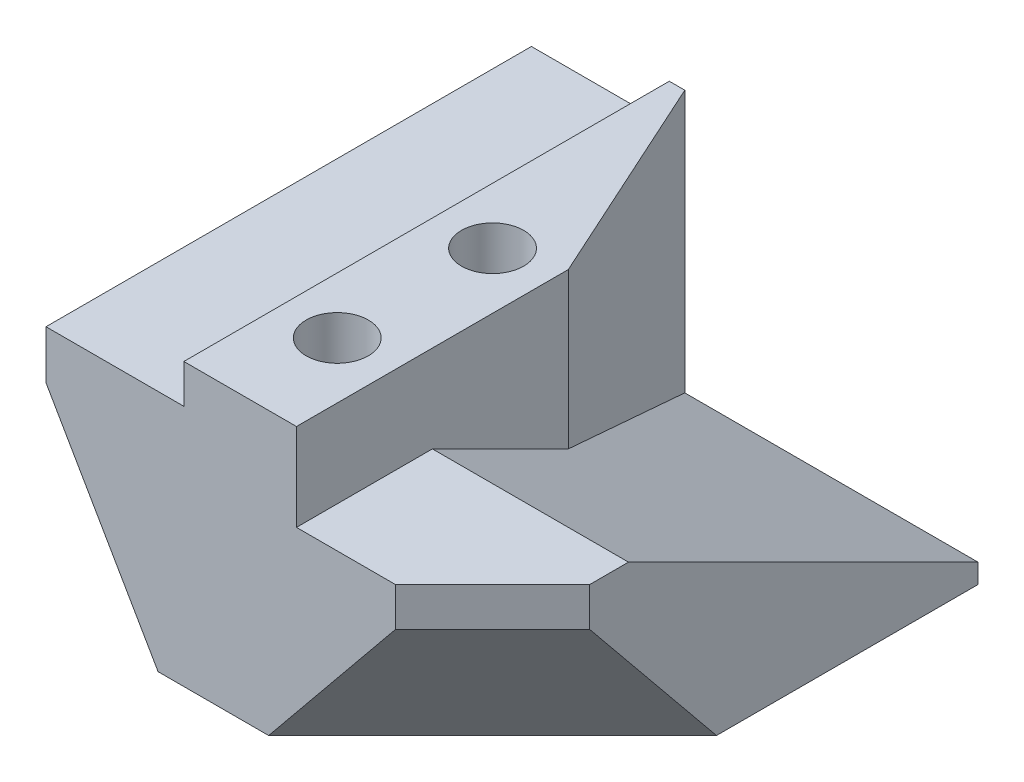
ISO-10303-21;
HEADER;
FILE_DESCRIPTION(('STEP AP214'),'2;1');
FILE_NAME('part.step','',(''),(''),'','','');
FILE_SCHEMA(('AUTOMOTIVE_DESIGN { 1 0 10303 214 1 1 1 1 }'));
ENDSEC;
DATA;
#1=APPLICATION_CONTEXT('core data for automotive mechanical design processes');
#2=APPLICATION_PROTOCOL_DEFINITION('international standard','automotive_design',2000,#1);
#3=PRODUCT_CONTEXT('',#1,'mechanical');
#4=PRODUCT('Part','Part','',(#3));
#5=PRODUCT_RELATED_PRODUCT_CATEGORY('part','',(#4));
#6=PRODUCT_DEFINITION_FORMATION('','',#4);
#7=PRODUCT_DEFINITION_CONTEXT('part definition',#1,'design');
#8=PRODUCT_DEFINITION('design','',#6,#7);
#9=PRODUCT_DEFINITION_SHAPE('','',#8);
#10=(LENGTH_UNIT() NAMED_UNIT(*) SI_UNIT(.MILLI.,.METRE.));
#11=(NAMED_UNIT(*) PLANE_ANGLE_UNIT() SI_UNIT($,.RADIAN.));
#12=(NAMED_UNIT(*) SI_UNIT($,.STERADIAN.) SOLID_ANGLE_UNIT());
#13=UNCERTAINTY_MEASURE_WITH_UNIT(LENGTH_MEASURE(1.E-05),#10,'distance_accuracy_value','');
#14=(GEOMETRIC_REPRESENTATION_CONTEXT(3) GLOBAL_UNCERTAINTY_ASSIGNED_CONTEXT((#13)) GLOBAL_UNIT_ASSIGNED_CONTEXT((#10,
#11,#12)) REPRESENTATION_CONTEXT('',''));
#15=CARTESIAN_POINT('',(0.,0.,0.));
#16=DIRECTION('',(0.,0.,1.));
#17=DIRECTION('',(1.,0.,0.));
#18=AXIS2_PLACEMENT_3D('',#15,#16,#17);
#19=CARTESIAN_POINT('',(12.9,8.5,-20.));
#20=DIRECTION('',(-1.,0.,0.));
#21=DIRECTION('',(0.,0.,1.));
#22=AXIS2_PLACEMENT_3D('',#19,#20,#21);
#23=PLANE('',#22);
#24=DIRECTION('',(0.,-0.447213595499958,-0.894427190999916));
#25=VECTOR('',#24,1.);
#26=CARTESIAN_POINT('',(12.9,6.,-7.));
#27=LINE('',#26,#25);
#28=CARTESIAN_POINT('',(12.9,6.,-7.));
#29=VERTEX_POINT('',#28);
#30=CARTESIAN_POINT('',(12.9,2.5,-14.));
#31=VERTEX_POINT('',#30);
#32=EDGE_CURVE('E336',#29,#31,#27,.T.);
#33=ORIENTED_EDGE('',*,*,#32,.T.);
#34=DIRECTION('',(0.,1.,0.));
#35=VECTOR('',#34,1.);
#36=CARTESIAN_POINT('',(12.9,-13.0461510298504,-14.));
#37=LINE('',#36,#35);
#38=CARTESIAN_POINT('',(12.9,10.5,-14.));
#39=VERTEX_POINT('',#38);
#40=EDGE_CURVE('E53',#31,#39,#37,.T.);
#41=ORIENTED_EDGE('',*,*,#40,.T.);
#42=DIRECTION('',(0.,0.,-1.));
#43=VECTOR('',#42,1.);
#44=CARTESIAN_POINT('',(12.9,10.5,-20.));
#45=LINE('',#44,#43);
#46=CARTESIAN_POINT('',(12.9,10.5,0.));
#47=VERTEX_POINT('',#46);
#48=EDGE_CURVE('E149',#47,#39,#45,.T.);
#49=ORIENTED_EDGE('',*,*,#48,.F.);
#50=DIRECTION('',(0.,-1.,0.));
#51=VECTOR('',#50,1.);
#52=CARTESIAN_POINT('',(12.9,8.5,0.));
#53=LINE('',#52,#51);
#54=CARTESIAN_POINT('',(12.9,6.,0.));
#55=VERTEX_POINT('',#54);
#56=EDGE_CURVE('E202',#47,#55,#53,.T.);
#57=ORIENTED_EDGE('',*,*,#56,.T.);
#58=DIRECTION('',(0.,0.,1.));
#59=VECTOR('',#58,1.);
#60=CARTESIAN_POINT('',(12.9,6.,-20.));
#61=LINE('',#60,#59);
#62=EDGE_CURVE('E159',#29,#55,#61,.T.);
#63=ORIENTED_EDGE('',*,*,#62,.F.);
#64=EDGE_LOOP('',(#33,#41,#49,#57,#63));
#65=FACE_BOUND('',#64,.T.);
#66=ADVANCED_FACE('F37',(#65),#23,.F.);
#67=CARTESIAN_POINT('',(10.,8.5,-13.));
#68=DIRECTION('',(0.,-1.,0.));
#69=DIRECTION('',(0.,0.,-1.));
#70=AXIS2_PLACEMENT_3D('',#67,#68,#69);
#71=CYLINDRICAL_SURFACE('',#70,1.6);
#72=CARTESIAN_POINT('',(10.,3.90000000000001,-13.));
#73=DIRECTION('',(0.,-1.,0.));
#74=DIRECTION('',(0.,0.,-1.));
#75=AXIS2_PLACEMENT_3D('',#72,#73,#74);
#76=CIRCLE('',#75,1.6);
#77=CARTESIAN_POINT('',(10.,3.90000000000001,-14.6));
#78=VERTEX_POINT('',#77);
#79=EDGE_CURVE('E234',#78,#78,#76,.T.);
#80=ORIENTED_EDGE('',*,*,#79,.T.);
#81=EDGE_LOOP('',(#80));
#82=FACE_BOUND('',#81,.T.);
#83=CARTESIAN_POINT('',(10.,10.5,-13.));
#84=DIRECTION('',(0.,1.,0.));
#85=DIRECTION('',(0.,0.,1.));
#86=AXIS2_PLACEMENT_3D('',#83,#84,#85);
#87=CIRCLE('',#86,1.6);
#88=CARTESIAN_POINT('',(10.,10.5,-11.4));
#89=VERTEX_POINT('',#88);
#90=EDGE_CURVE('E183',#89,#89,#87,.T.);
#91=ORIENTED_EDGE('',*,*,#90,.T.);
#92=EDGE_LOOP('',(#91));
#93=FACE_BOUND('',#92,.T.);
#94=ADVANCED_FACE('F259',(#82,#93),#71,.F.);
#95=CARTESIAN_POINT('',(10.,8.5,-5.));
#96=DIRECTION('',(0.,-1.,0.));
#97=DIRECTION('',(0.,0.,-1.));
#98=AXIS2_PLACEMENT_3D('',#95,#96,#97);
#99=CYLINDRICAL_SURFACE('',#98,1.6);
#100=CARTESIAN_POINT('',(10.,3.90000000000001,-5.));
#101=DIRECTION('',(0.,-1.,0.));
#102=DIRECTION('',(0.,0.,-1.));
#103=AXIS2_PLACEMENT_3D('',#100,#101,#102);
#104=CIRCLE('',#103,1.6);
#105=CARTESIAN_POINT('',(10.,3.90000000000001,-6.6));
#106=VERTEX_POINT('',#105);
#107=EDGE_CURVE('E237',#106,#106,#104,.T.);
#108=ORIENTED_EDGE('',*,*,#107,.T.);
#109=EDGE_LOOP('',(#108));
#110=FACE_BOUND('',#109,.T.);
#111=CARTESIAN_POINT('',(10.,10.5,-5.));
#112=DIRECTION('',(0.,1.,0.));
#113=DIRECTION('',(0.,0.,1.));
#114=AXIS2_PLACEMENT_3D('',#111,#112,#113);
#115=CIRCLE('',#114,1.6);
#116=CARTESIAN_POINT('',(10.,10.5,-3.4));
#117=VERTEX_POINT('',#116);
#118=EDGE_CURVE('E180',#117,#117,#115,.T.);
#119=ORIENTED_EDGE('',*,*,#118,.T.);
#120=EDGE_LOOP('',(#119));
#121=FACE_BOUND('',#120,.T.);
#122=ADVANCED_FACE('F266',(#110,#121),#99,.F.);
#123=CARTESIAN_POINT('',(0.,4.,0.));
#124=DIRECTION('',(1.,0.,0.));
#125=DIRECTION('',(0.,0.,-1.));
#126=AXIS2_PLACEMENT_3D('',#123,#124,#125);
#127=PLANE('',#126);
#128=DIRECTION('',(0.,1.,0.));
#129=VECTOR('',#128,1.);
#130=CARTESIAN_POINT('',(0.,-4.,-25.));
#131=LINE('',#130,#129);
#132=CARTESIAN_POINT('',(0.,6.00000000000006,-25.));
#133=VERTEX_POINT('',#132);
#134=CARTESIAN_POINT('',(0.,8.5,-25.));
#135=VERTEX_POINT('',#134);
#136=EDGE_CURVE('E321',#133,#135,#131,.T.);
#137=ORIENTED_EDGE('',*,*,#136,.F.);
#138=DIRECTION('',(0.,0.,1.));
#139=VECTOR('',#138,1.);
#140=CARTESIAN_POINT('',(0.,6.00000000000006,0.));
#141=LINE('',#140,#139);
#142=CARTESIAN_POINT('',(0.,6.00000000000006,0.));
#143=VERTEX_POINT('',#142);
#144=EDGE_CURVE('E213',#133,#143,#141,.T.);
#145=ORIENTED_EDGE('',*,*,#144,.T.);
#146=DIRECTION('',(0.,-1.,0.));
#147=VECTOR('',#146,1.);
#148=CARTESIAN_POINT('',(0.,4.,0.));
#149=LINE('',#148,#147);
#150=CARTESIAN_POINT('',(0.,8.5,0.));
#151=VERTEX_POINT('',#150);
#152=EDGE_CURVE('E205',#151,#143,#149,.T.);
#153=ORIENTED_EDGE('',*,*,#152,.F.);
#154=DIRECTION('',(0.,0.,1.));
#155=VECTOR('',#154,1.);
#156=CARTESIAN_POINT('',(0.,8.5,-20.));
#157=LINE('',#156,#155);
#158=EDGE_CURVE('E197',#135,#151,#157,.T.);
#159=ORIENTED_EDGE('',*,*,#158,.F.);
#160=EDGE_LOOP('',(#137,#145,#153,#159));
#161=FACE_BOUND('',#160,.T.);
#162=ADVANCED_FACE('F276',(#161),#127,.F.);
#163=CARTESIAN_POINT('',(0.,4.,0.));
#164=DIRECTION('',(0.,0.,-1.));
#165=DIRECTION('',(-1.,0.,0.));
#166=AXIS2_PLACEMENT_3D('',#163,#164,#165);
#167=PLANE('',#166);
#168=DIRECTION('',(-1.,0.,0.));
#169=VECTOR('',#168,1.);
#170=CARTESIAN_POINT('',(23.,-4.,0.));
#171=LINE('',#170,#169);
#172=CARTESIAN_POINT('',(11.4680273525782,-4.,0.));
#173=VERTEX_POINT('',#172);
#174=CARTESIAN_POINT('',(5.77350269189626,-4.,0.));
#175=VERTEX_POINT('',#174);
#176=EDGE_CURVE('E178',#173,#175,#171,.T.);
#177=ORIENTED_EDGE('',*,*,#176,.F.);
#178=DIRECTION('',(-0.632455532033674,-0.774596669241485,0.));
#179=VECTOR('',#178,1.);
#180=CARTESIAN_POINT('',(9.17442188206252,-6.80908153700972,0.));
#181=LINE('',#180,#179);
#182=CARTESIAN_POINT('',(18.,4.00000000000006,0.));
#183=VERTEX_POINT('',#182);
#184=EDGE_CURVE('E228',#173,#183,#181,.F.);
#185=ORIENTED_EDGE('',*,*,#184,.T.);
#186=DIRECTION('',(0.,1.,0.));
#187=VECTOR('',#186,1.);
#188=CARTESIAN_POINT('',(18.,6.,0.));
#189=LINE('',#188,#187);
#190=CARTESIAN_POINT('',(18.,6.,0.));
#191=VERTEX_POINT('',#190);
#192=EDGE_CURVE('E221',#183,#191,#189,.T.);
#193=ORIENTED_EDGE('',*,*,#192,.T.);
#194=DIRECTION('',(1.,0.,0.));
#195=VECTOR('',#194,1.);
#196=CARTESIAN_POINT('',(23.,6.,0.));
#197=LINE('',#196,#195);
#198=EDGE_CURVE('E166',#55,#191,#197,.T.);
#199=ORIENTED_EDGE('',*,*,#198,.F.);
#200=ORIENTED_EDGE('',*,*,#56,.F.);
#201=DIRECTION('',(1.,0.,0.));
#202=VECTOR('',#201,1.);
#203=CARTESIAN_POINT('',(7.1,10.5,0.));
#204=LINE('',#203,#202);
#205=CARTESIAN_POINT('',(7.1,10.5,0.));
#206=VERTEX_POINT('',#205);
#207=EDGE_CURVE('E189',#206,#47,#204,.T.);
#208=ORIENTED_EDGE('',*,*,#207,.F.);
#209=DIRECTION('',(0.,-1.,0.));
#210=VECTOR('',#209,1.);
#211=CARTESIAN_POINT('',(7.1,10.5,0.));
#212=LINE('',#211,#210);
#213=CARTESIAN_POINT('',(7.1,8.5,0.));
#214=VERTEX_POINT('',#213);
#215=EDGE_CURVE('E192',#206,#214,#212,.T.);
#216=ORIENTED_EDGE('',*,*,#215,.T.);
#217=DIRECTION('',(1.,0.,0.));
#218=VECTOR('',#217,1.);
#219=CARTESIAN_POINT('',(0.,8.5,0.));
#220=LINE('',#219,#218);
#221=EDGE_CURVE('E200',#151,#214,#220,.T.);
#222=ORIENTED_EDGE('',*,*,#221,.F.);
#223=ORIENTED_EDGE('',*,*,#152,.T.);
#224=DIRECTION('',(0.499999999999998,-0.86602540378444,0.));
#225=VECTOR('',#224,1.);
#226=CARTESIAN_POINT('',(5.77350269189626,-4.,0.));
#227=LINE('',#226,#225);
#228=EDGE_CURVE('E215',#143,#175,#227,.T.);
#229=ORIENTED_EDGE('',*,*,#228,.T.);
#230=EDGE_LOOP('',(#177,#185,#193,#199,#200,#208,#216,#222,#223,#229));
#231=FACE_BOUND('',#230,.T.);
#232=ADVANCED_FACE('F273',(#231),#167,.F.);
#233=CARTESIAN_POINT('',(0.,8.5,0.));
#234=DIRECTION('',(0.,1.,0.));
#235=DIRECTION('',(0.,0.,1.));
#236=AXIS2_PLACEMENT_3D('',#233,#234,#235);
#237=PLANE('',#236);
#238=DIRECTION('',(0.,0.,1.));
#239=VECTOR('',#238,1.);
#240=CARTESIAN_POINT('',(7.1,8.5,-20.));
#241=LINE('',#240,#239);
#242=CARTESIAN_POINT('',(7.1,8.5,-25.));
#243=VERTEX_POINT('',#242);
#244=EDGE_CURVE('E186',#243,#214,#241,.T.);
#245=ORIENTED_EDGE('',*,*,#244,.F.);
#246=DIRECTION('',(1.,0.,0.));
#247=VECTOR('',#246,1.);
#248=CARTESIAN_POINT('',(0.,8.5,-25.));
#249=LINE('',#248,#247);
#250=EDGE_CURVE('E161',#135,#243,#249,.T.);
#251=ORIENTED_EDGE('',*,*,#250,.F.);
#252=ORIENTED_EDGE('',*,*,#158,.T.);
#253=ORIENTED_EDGE('',*,*,#221,.T.);
#254=EDGE_LOOP('',(#245,#251,#252,#253));
#255=FACE_BOUND('',#254,.T.);
#256=ADVANCED_FACE('F272',(#255),#237,.T.);
#257=CARTESIAN_POINT('',(0.,10.5,0.));
#258=DIRECTION('',(0.,1.,0.));
#259=DIRECTION('',(0.,0.,1.));
#260=AXIS2_PLACEMENT_3D('',#257,#258,#259);
#261=PLANE('',#260);
#262=DIRECTION('',(0.413802944301184,0.,0.910366477462605));
#263=VECTOR('',#262,1.);
#264=CARTESIAN_POINT('',(12.9,10.5,-14.));
#265=LINE('',#264,#263);
#266=CARTESIAN_POINT('',(7.9,10.5,-25.));
#267=VERTEX_POINT('',#266);
#268=EDGE_CURVE('E135',#267,#39,#265,.T.);
#269=ORIENTED_EDGE('',*,*,#268,.F.);
#270=DIRECTION('',(1.,0.,0.));
#271=VECTOR('',#270,1.);
#272=CARTESIAN_POINT('',(7.1,10.5,-25.));
#273=LINE('',#272,#271);
#274=CARTESIAN_POINT('',(7.1,10.5,-25.));
#275=VERTEX_POINT('',#274);
#276=EDGE_CURVE('E146',#275,#267,#273,.T.);
#277=ORIENTED_EDGE('',*,*,#276,.F.);
#278=DIRECTION('',(0.,0.,1.));
#279=VECTOR('',#278,1.);
#280=CARTESIAN_POINT('',(7.1,10.5,-20.));
#281=LINE('',#280,#279);
#282=EDGE_CURVE('E187',#275,#206,#281,.T.);
#283=ORIENTED_EDGE('',*,*,#282,.T.);
#284=ORIENTED_EDGE('',*,*,#207,.T.);
#285=ORIENTED_EDGE('',*,*,#48,.T.);
#286=EDGE_LOOP('',(#269,#277,#283,#284,#285));
#287=FACE_BOUND('',#286,.T.);
#288=ORIENTED_EDGE('',*,*,#90,.F.);
#289=EDGE_LOOP('',(#288));
#290=FACE_BOUND('',#289,.T.);
#291=ORIENTED_EDGE('',*,*,#118,.F.);
#292=EDGE_LOOP('',(#291));
#293=FACE_BOUND('',#292,.T.);
#294=ADVANCED_FACE('F143',(#287,#290,#293),#261,.T.);
#295=CARTESIAN_POINT('',(7.1,10.5,-20.));
#296=DIRECTION('',(1.,0.,0.));
#297=DIRECTION('',(0.,0.,-1.));
#298=AXIS2_PLACEMENT_3D('',#295,#296,#297);
#299=PLANE('',#298);
#300=ORIENTED_EDGE('',*,*,#244,.T.);
#301=ORIENTED_EDGE('',*,*,#215,.F.);
#302=ORIENTED_EDGE('',*,*,#282,.F.);
#303=DIRECTION('',(0.,1.,0.));
#304=VECTOR('',#303,1.);
#305=CARTESIAN_POINT('',(7.1,8.5,-25.));
#306=LINE('',#305,#304);
#307=EDGE_CURVE('E155',#243,#275,#306,.T.);
#308=ORIENTED_EDGE('',*,*,#307,.F.);
#309=EDGE_LOOP('',(#300,#301,#302,#308));
#310=FACE_BOUND('',#309,.T.);
#311=ADVANCED_FACE('F333',(#310),#299,.F.);
#312=CARTESIAN_POINT('',(10.,2.4,-5.));
#313=DIRECTION('',(0.,-1.,0.));
#314=DIRECTION('',(0.,0.,-1.));
#315=AXIS2_PLACEMENT_3D('',#312,#313,#314);
#316=CYLINDRICAL_SURFACE('',#315,3.);
#317=CARTESIAN_POINT('',(10.,2.50000000000002,-5.));
#318=DIRECTION('',(0.,-1.,0.));
#319=DIRECTION('',(0.,0.,-1.));
#320=AXIS2_PLACEMENT_3D('',#317,#318,#319);
#321=CIRCLE('',#320,3.);
#322=CARTESIAN_POINT('',(10.,2.50000000000002,-8.));
#323=VERTEX_POINT('',#322);
#324=EDGE_CURVE('E11',#323,#323,#321,.F.);
#325=ORIENTED_EDGE('',*,*,#324,.T.);
#326=EDGE_LOOP('',(#325));
#327=FACE_BOUND('',#326,.T.);
#328=CARTESIAN_POINT('',(10.,-4.,-5.));
#329=DIRECTION('',(0.,-1.,0.));
#330=DIRECTION('',(0.,0.,-1.));
#331=AXIS2_PLACEMENT_3D('',#328,#329,#330);
#332=CIRCLE('',#331,3.);
#333=CARTESIAN_POINT('',(10.,-4.,-8.));
#334=VERTEX_POINT('',#333);
#335=EDGE_CURVE('E169',#334,#334,#332,.T.);
#336=ORIENTED_EDGE('',*,*,#335,.T.);
#337=EDGE_LOOP('',(#336));
#338=FACE_BOUND('',#337,.T.);
#339=ADVANCED_FACE('F360',(#327,#338),#316,.F.);
#340=CARTESIAN_POINT('',(10.,2.4,-13.));
#341=DIRECTION('',(0.,-1.,0.));
#342=DIRECTION('',(0.,0.,-1.));
#343=AXIS2_PLACEMENT_3D('',#340,#341,#342);
#344=CYLINDRICAL_SURFACE('',#343,3.);
#345=CARTESIAN_POINT('',(10.,2.50000000000002,-13.));
#346=DIRECTION('',(0.,-1.,0.));
#347=DIRECTION('',(0.,0.,-1.));
#348=AXIS2_PLACEMENT_3D('',#345,#346,#347);
#349=CIRCLE('',#348,3.);
#350=CARTESIAN_POINT('',(10.,2.50000000000002,-16.));
#351=VERTEX_POINT('',#350);
#352=EDGE_CURVE('E46',#351,#351,#349,.F.);
#353=ORIENTED_EDGE('',*,*,#352,.T.);
#354=EDGE_LOOP('',(#353));
#355=FACE_BOUND('',#354,.T.);
#356=CARTESIAN_POINT('',(10.,-4.,-13.));
#357=DIRECTION('',(0.,-1.,0.));
#358=DIRECTION('',(0.,0.,-1.));
#359=AXIS2_PLACEMENT_3D('',#356,#357,#358);
#360=CIRCLE('',#359,3.);
#361=CARTESIAN_POINT('',(10.,-4.,-16.));
#362=VERTEX_POINT('',#361);
#363=EDGE_CURVE('E172',#362,#362,#360,.T.);
#364=ORIENTED_EDGE('',*,*,#363,.T.);
#365=EDGE_LOOP('',(#364));
#366=FACE_BOUND('',#365,.T.);
#367=ADVANCED_FACE('F242',(#355,#366),#344,.F.);
#368=CARTESIAN_POINT('',(23.,0.,0.));
#369=DIRECTION('',(1.,0.,0.));
#370=DIRECTION('',(0.,0.,-1.));
#371=AXIS2_PLACEMENT_3D('',#368,#369,#370);
#372=PLANE('',#371);
#373=DIRECTION('',(0.,-0.447213595499958,-0.894427190999916));
#374=VECTOR('',#373,1.);
#375=CARTESIAN_POINT('',(23.,6.,-7.));
#376=LINE('',#375,#374);
#377=CARTESIAN_POINT('',(23.,6.,-7.));
#378=VERTEX_POINT('',#377);
#379=CARTESIAN_POINT('',(23.,-3.,-25.));
#380=VERTEX_POINT('',#379);
#381=EDGE_CURVE('E61',#378,#380,#376,.T.);
#382=ORIENTED_EDGE('',*,*,#381,.F.);
#383=DIRECTION('',(0.,0.,-1.));
#384=VECTOR('',#383,1.);
#385=CARTESIAN_POINT('',(23.,6.,-20.));
#386=LINE('',#385,#384);
#387=CARTESIAN_POINT('',(23.,6.,-5.));
#388=VERTEX_POINT('',#387);
#389=EDGE_CURVE('E156',#388,#378,#386,.T.);
#390=ORIENTED_EDGE('',*,*,#389,.F.);
#391=DIRECTION('',(0.,-1.,0.));
#392=VECTOR('',#391,1.);
#393=CARTESIAN_POINT('',(23.,-4.,-5.));
#394=LINE('',#393,#392);
#395=CARTESIAN_POINT('',(23.,4.00000000000006,-5.));
#396=VERTEX_POINT('',#395);
#397=EDGE_CURVE('E218',#388,#396,#394,.T.);
#398=ORIENTED_EDGE('',*,*,#397,.T.);
#399=DIRECTION('',(0.,0.774596669241486,0.632455532033673));
#400=VECTOR('',#399,1.);
#401=CARTESIAN_POINT('',(23.,4.04948974278318,-4.95959179422659));
#402=LINE('',#401,#400);
#403=CARTESIAN_POINT('',(23.,-4.,-11.5319726474218));
#404=VERTEX_POINT('',#403);
#405=EDGE_CURVE('E232',#396,#404,#402,.F.);
#406=ORIENTED_EDGE('',*,*,#405,.T.);
#407=DIRECTION('',(0.,0.,1.));
#408=VECTOR('',#407,1.);
#409=CARTESIAN_POINT('',(23.,-4.,-20.));
#410=LINE('',#409,#408);
#411=CARTESIAN_POINT('',(23.,-4.,-25.));
#412=VERTEX_POINT('',#411);
#413=EDGE_CURVE('E175',#412,#404,#410,.T.);
#414=ORIENTED_EDGE('',*,*,#413,.F.);
#415=DIRECTION('',(0.,-1.,0.));
#416=VECTOR('',#415,1.);
#417=CARTESIAN_POINT('',(23.,6.,-25.));
#418=LINE('',#417,#416);
#419=EDGE_CURVE('E322',#380,#412,#418,.T.);
#420=ORIENTED_EDGE('',*,*,#419,.F.);
#421=EDGE_LOOP('',(#382,#390,#398,#406,#414,#420));
#422=FACE_BOUND('',#421,.T.);
#423=ADVANCED_FACE('F309',(#422),#372,.T.);
#424=CARTESIAN_POINT('',(0.,-4.,0.));
#425=DIRECTION('',(0.,-1.,0.));
#426=DIRECTION('',(0.,0.,-1.));
#427=AXIS2_PLACEMENT_3D('',#424,#425,#426);
#428=PLANE('',#427);
#429=ORIENTED_EDGE('',*,*,#363,.F.);
#430=EDGE_LOOP('',(#429));
#431=FACE_BOUND('',#430,.T.);
#432=ORIENTED_EDGE('',*,*,#413,.T.);
#433=DIRECTION('',(-0.707106781186549,0.,0.707106781186546));
#434=VECTOR('',#433,1.);
#435=CARTESIAN_POINT('',(5.73401367628906,-4.,5.73401367628908));
#436=LINE('',#435,#434);
#437=EDGE_CURVE('E225',#404,#173,#436,.T.);
#438=ORIENTED_EDGE('',*,*,#437,.T.);
#439=ORIENTED_EDGE('',*,*,#176,.T.);
#440=DIRECTION('',(0.,0.,-1.));
#441=VECTOR('',#440,1.);
#442=CARTESIAN_POINT('',(5.77350269189626,-4.,-25.));
#443=LINE('',#442,#441);
#444=CARTESIAN_POINT('',(5.77350269189626,-4.,-25.));
#445=VERTEX_POINT('',#444);
#446=EDGE_CURVE('E208',#175,#445,#443,.T.);
#447=ORIENTED_EDGE('',*,*,#446,.T.);
#448=DIRECTION('',(-1.,0.,0.));
#449=VECTOR('',#448,1.);
#450=CARTESIAN_POINT('',(23.,-4.,-25.));
#451=LINE('',#450,#449);
#452=EDGE_CURVE('E319',#412,#445,#451,.T.);
#453=ORIENTED_EDGE('',*,*,#452,.F.);
#454=EDGE_LOOP('',(#432,#438,#439,#447,#453));
#455=FACE_BOUND('',#454,.T.);
#456=ORIENTED_EDGE('',*,*,#335,.F.);
#457=EDGE_LOOP('',(#456));
#458=FACE_BOUND('',#457,.T.);
#459=ADVANCED_FACE('F315',(#431,#455,#458),#428,.T.);
#460=CARTESIAN_POINT('',(0.,6.,0.));
#461=DIRECTION('',(0.,-1.,0.));
#462=DIRECTION('',(0.,0.,-1.));
#463=AXIS2_PLACEMENT_3D('',#460,#461,#462);
#464=PLANE('',#463);
#465=ORIENTED_EDGE('',*,*,#389,.T.);
#466=DIRECTION('',(1.,0.,0.));
#467=VECTOR('',#466,1.);
#468=CARTESIAN_POINT('',(-7.22461179749811,6.,-7.));
#469=LINE('',#468,#467);
#470=EDGE_CURVE('E338',#29,#378,#469,.T.);
#471=ORIENTED_EDGE('',*,*,#470,.F.);
#472=ORIENTED_EDGE('',*,*,#62,.T.);
#473=ORIENTED_EDGE('',*,*,#198,.T.);
#474=DIRECTION('',(0.707106781186549,0.,-0.707106781186546));
#475=VECTOR('',#474,1.);
#476=CARTESIAN_POINT('',(23.,6.,-5.));
#477=LINE('',#476,#475);
#478=EDGE_CURVE('E223',#191,#388,#477,.T.);
#479=ORIENTED_EDGE('',*,*,#478,.T.);
#480=EDGE_LOOP('',(#465,#471,#472,#473,#479));
#481=FACE_BOUND('',#480,.T.);
#482=ADVANCED_FACE('F345',(#481),#464,.F.);
#483=CARTESIAN_POINT('',(0.,0.,-25.));
#484=DIRECTION('',(0.,0.,-1.));
#485=DIRECTION('',(-1.,0.,0.));
#486=AXIS2_PLACEMENT_3D('',#483,#484,#485);
#487=PLANE('',#486);
#488=DIRECTION('',(0.,1.,0.));
#489=VECTOR('',#488,1.);
#490=CARTESIAN_POINT('',(7.9,-13.0461510298504,-25.));
#491=LINE('',#490,#489);
#492=CARTESIAN_POINT('',(7.9,-3.,-25.));
#493=VERTEX_POINT('',#492);
#494=EDGE_CURVE('E132',#493,#267,#491,.T.);
#495=ORIENTED_EDGE('',*,*,#494,.F.);
#496=DIRECTION('',(1.,0.,0.));
#497=VECTOR('',#496,1.);
#498=CARTESIAN_POINT('',(-7.22461179749811,-3.,-25.));
#499=LINE('',#498,#497);
#500=EDGE_CURVE('E325',#493,#380,#499,.T.);
#501=ORIENTED_EDGE('',*,*,#500,.T.);
#502=ORIENTED_EDGE('',*,*,#419,.T.);
#503=ORIENTED_EDGE('',*,*,#452,.T.);
#504=DIRECTION('',(-0.499999999999998,0.86602540378444,0.));
#505=VECTOR('',#504,1.);
#506=CARTESIAN_POINT('',(2.59807621135334,1.5,-25.));
#507=LINE('',#506,#505);
#508=EDGE_CURVE('E211',#445,#133,#507,.T.);
#509=ORIENTED_EDGE('',*,*,#508,.T.);
#510=ORIENTED_EDGE('',*,*,#136,.T.);
#511=ORIENTED_EDGE('',*,*,#250,.T.);
#512=ORIENTED_EDGE('',*,*,#307,.T.);
#513=ORIENTED_EDGE('',*,*,#276,.T.);
#514=EDGE_LOOP('',(#495,#501,#502,#503,#509,#510,#511,#512,#513));
#515=FACE_BOUND('',#514,.T.);
#516=ADVANCED_FACE('F152',(#515),#487,.T.);
#517=CARTESIAN_POINT('',(5.77350269189626,-4.,0.));
#518=DIRECTION('',(-0.86602540378444,-0.499999999999998,0.));
#519=DIRECTION('',(0.,0.,1.));
#520=AXIS2_PLACEMENT_3D('',#517,#518,#519);
#521=PLANE('',#520);
#522=ORIENTED_EDGE('',*,*,#228,.F.);
#523=ORIENTED_EDGE('',*,*,#144,.F.);
#524=ORIENTED_EDGE('',*,*,#508,.F.);
#525=ORIENTED_EDGE('',*,*,#446,.F.);
#526=EDGE_LOOP('',(#522,#523,#524,#525));
#527=FACE_BOUND('',#526,.T.);
#528=ADVANCED_FACE('F282',(#527),#521,.T.);
#529=CARTESIAN_POINT('',(23.,0.,-5.));
#530=DIRECTION('',(0.707106781186546,0.,0.707106781186549));
#531=DIRECTION('',(0.,1.,0.));
#532=AXIS2_PLACEMENT_3D('',#529,#530,#531);
#533=PLANE('',#532);
#534=ORIENTED_EDGE('',*,*,#192,.F.);
#535=DIRECTION('',(0.707106781186549,0.,-0.707106781186546));
#536=VECTOR('',#535,1.);
#537=CARTESIAN_POINT('',(23.,4.00000000000006,-5.));
#538=LINE('',#537,#536);
#539=EDGE_CURVE('E230',#183,#396,#538,.T.);
#540=ORIENTED_EDGE('',*,*,#539,.T.);
#541=ORIENTED_EDGE('',*,*,#397,.F.);
#542=ORIENTED_EDGE('',*,*,#478,.F.);
#543=EDGE_LOOP('',(#534,#540,#541,#542));
#544=FACE_BOUND('',#543,.T.);
#545=ADVANCED_FACE('F288',(#544),#533,.T.);
#546=CARTESIAN_POINT('',(5.73401367628906,-4.,5.73401367628908));
#547=DIRECTION('',(-0.612372435695794,0.499999999999998,-0.612372435695796));
#548=DIRECTION('',(-0.707106781186549,0.,0.707106781186546));
#549=AXIS2_PLACEMENT_3D('',#546,#547,#548);
#550=PLANE('',#549);
#551=ORIENTED_EDGE('',*,*,#405,.F.);
#552=ORIENTED_EDGE('',*,*,#539,.F.);
#553=ORIENTED_EDGE('',*,*,#184,.F.);
#554=ORIENTED_EDGE('',*,*,#437,.F.);
#555=EDGE_LOOP('',(#551,#552,#553,#554));
#556=FACE_BOUND('',#555,.T.);
#557=ADVANCED_FACE('F294',(#556),#550,.F.);
#558=CARTESIAN_POINT('',(-7.22461179749811,6.,-7.));
#559=DIRECTION('',(0.,-0.894427190999916,0.447213595499958));
#560=DIRECTION('',(0.,-0.447213595499958,-0.894427190999916));
#561=AXIS2_PLACEMENT_3D('',#558,#559,#560);
#562=PLANE('',#561);
#563=ORIENTED_EDGE('',*,*,#470,.T.);
#564=ORIENTED_EDGE('',*,*,#381,.T.);
#565=ORIENTED_EDGE('',*,*,#500,.F.);
#566=DIRECTION('',(0.376621788577355,0.41428396743509,0.82856793487018));
#567=VECTOR('',#566,1.);
#568=CARTESIAN_POINT('',(10.4743594137822,-0.168204644839577,-19.3364092896792));
#569=LINE('',#568,#567);
#570=EDGE_CURVE('E136',#493,#31,#569,.T.);
#571=ORIENTED_EDGE('',*,*,#570,.T.);
#572=ORIENTED_EDGE('',*,*,#32,.F.);
#573=EDGE_LOOP('',(#563,#564,#565,#571,#572));
#574=FACE_BOUND('',#573,.T.);
#575=ADVANCED_FACE('F253',(#574),#562,.F.);
#576=CARTESIAN_POINT('',(12.9,-13.0461510298504,-14.));
#577=DIRECTION('',(-0.910366477462605,0.,0.413802944301184));
#578=DIRECTION('',(0.413802944301184,0.,0.910366477462605));
#579=AXIS2_PLACEMENT_3D('',#576,#577,#578);
#580=PLANE('',#579);
#581=ORIENTED_EDGE('',*,*,#494,.T.);
#582=ORIENTED_EDGE('',*,*,#268,.T.);
#583=ORIENTED_EDGE('',*,*,#40,.F.);
#584=ORIENTED_EDGE('',*,*,#570,.F.);
#585=EDGE_LOOP('',(#581,#582,#583,#584));
#586=FACE_BOUND('',#585,.T.);
#587=ADVANCED_FACE('F134',(#586),#580,.F.);
#588=CARTESIAN_POINT('',(10.,2.4,-13.));
#589=DIRECTION('',(0.,-1.,0.));
#590=DIRECTION('',(0.,0.,-1.));
#591=AXIS2_PLACEMENT_3D('',#588,#589,#590);
#592=CONICAL_SURFACE('',#591,3.10000000000003,0.785398163397453);
#593=ORIENTED_EDGE('',*,*,#79,.F.);
#594=EDGE_LOOP('',(#593));
#595=FACE_BOUND('',#594,.T.);
#596=ORIENTED_EDGE('',*,*,#352,.F.);
#597=EDGE_LOOP('',(#596));
#598=FACE_BOUND('',#597,.T.);
#599=ADVANCED_FACE('F245',(#595,#598),#592,.F.);
#600=CARTESIAN_POINT('',(10.,2.4,-5.));
#601=DIRECTION('',(0.,-1.,0.));
#602=DIRECTION('',(0.,0.,-1.));
#603=AXIS2_PLACEMENT_3D('',#600,#601,#602);
#604=CONICAL_SURFACE('',#603,3.10000000000003,0.785398163397453);
#605=ORIENTED_EDGE('',*,*,#107,.F.);
#606=EDGE_LOOP('',(#605));
#607=FACE_BOUND('',#606,.T.);
#608=ORIENTED_EDGE('',*,*,#324,.F.);
#609=EDGE_LOOP('',(#608));
#610=FACE_BOUND('',#609,.T.);
#611=ADVANCED_FACE('F40',(#607,#610),#604,.F.);
#612=CLOSED_SHELL('',(#66,#94,#122,#162,#232,#256,#294,#311,#339,#367,#423,#459,#482,#516,#528,
#545,#557,#575,#587,#599,#611));
#613=MANIFOLD_SOLID_BREP('B2',#612);
#614=ADVANCED_BREP_SHAPE_REPRESENTATION('',(#18,#613),#14);
#615=SHAPE_DEFINITION_REPRESENTATION(#9,#614);
ENDSEC;
END-ISO-10303-21;
